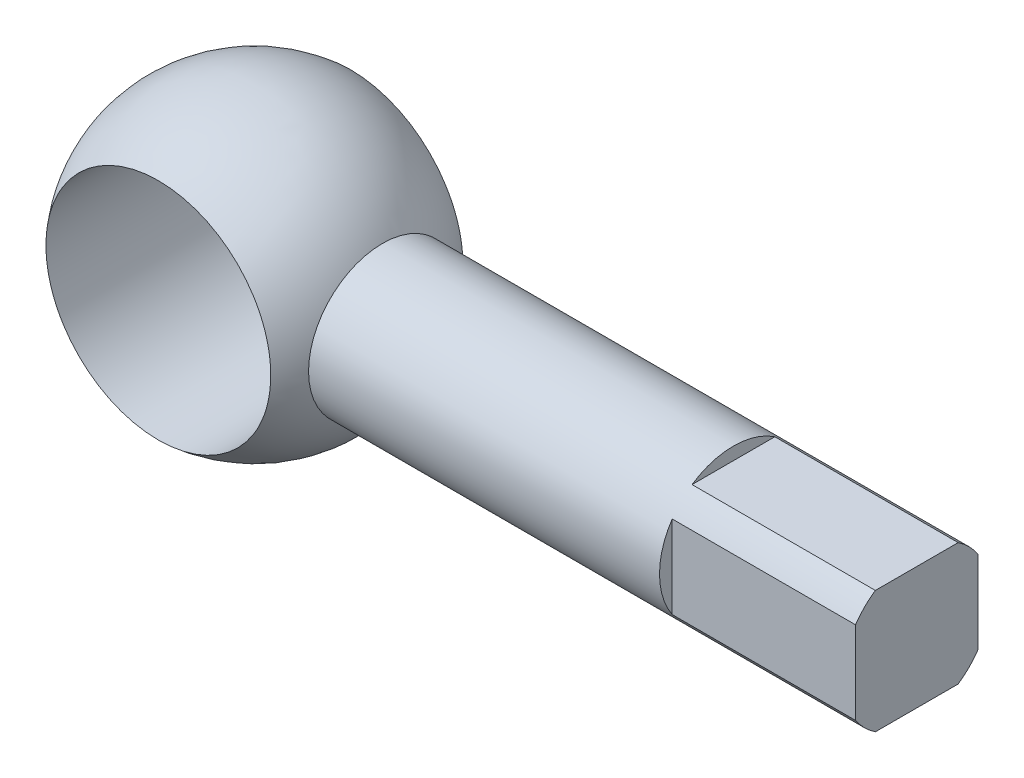
ISO-10303-21;
HEADER;
FILE_DESCRIPTION(('STEP AP214'),'2;1');
FILE_NAME('part.step','',(''),(''),'','','');
FILE_SCHEMA(('AUTOMOTIVE_DESIGN { 1 0 10303 214 1 1 1 1 }'));
ENDSEC;
DATA;
#1=APPLICATION_CONTEXT('core data for automotive mechanical design processes');
#2=APPLICATION_PROTOCOL_DEFINITION('international standard','automotive_design',2000,#1);
#3=PRODUCT_CONTEXT('',#1,'mechanical');
#4=PRODUCT('Part','Part','',(#3));
#5=PRODUCT_RELATED_PRODUCT_CATEGORY('part','',(#4));
#6=PRODUCT_DEFINITION_FORMATION('','',#4);
#7=PRODUCT_DEFINITION_CONTEXT('part definition',#1,'design');
#8=PRODUCT_DEFINITION('design','',#6,#7);
#9=PRODUCT_DEFINITION_SHAPE('','',#8);
#10=(LENGTH_UNIT() NAMED_UNIT(*) SI_UNIT(.MILLI.,.METRE.));
#11=(NAMED_UNIT(*) PLANE_ANGLE_UNIT() SI_UNIT($,.RADIAN.));
#12=(NAMED_UNIT(*) SI_UNIT($,.STERADIAN.) SOLID_ANGLE_UNIT());
#13=UNCERTAINTY_MEASURE_WITH_UNIT(LENGTH_MEASURE(1.E-05),#10,'distance_accuracy_value','');
#14=(GEOMETRIC_REPRESENTATION_CONTEXT(3) GLOBAL_UNCERTAINTY_ASSIGNED_CONTEXT((#13)) GLOBAL_UNIT_ASSIGNED_CONTEXT((#10,
#11,#12)) REPRESENTATION_CONTEXT('',''));
#15=CARTESIAN_POINT('',(0.,0.,0.));
#16=DIRECTION('',(0.,0.,1.));
#17=DIRECTION('',(1.,0.,0.));
#18=AXIS2_PLACEMENT_3D('',#15,#16,#17);
#19=CARTESIAN_POINT('',(0.,0.,0.));
#20=DIRECTION('',(-1.,0.,0.));
#21=DIRECTION('',(0.,1.,0.));
#22=AXIS2_PLACEMENT_3D('',#19,#20,#21);
#23=SPHERICAL_SURFACE('',#22,25.);
#24=CARTESIAN_POINT('',(0.,0.,16.2480768092719));
#25=DIRECTION('',(0.,0.,-1.));
#26=DIRECTION('',(-1.,0.,0.));
#27=AXIS2_PLACEMENT_3D('',#24,#25,#26);
#28=CIRCLE('',#27,19.);
#29=CARTESIAN_POINT('',(-19.,0.,16.2480768092719));
#30=VERTEX_POINT('',#29);
#31=EDGE_CURVE('E139',#30,#30,#28,.T.);
#32=ORIENTED_EDGE('',*,*,#31,.T.);
#33=EDGE_LOOP('',(#32));
#34=FACE_BOUND('',#33,.T.);
#35=CARTESIAN_POINT('',(0.,0.,-16.2480768092719));
#36=DIRECTION('',(0.,0.,1.));
#37=DIRECTION('',(1.,0.,0.));
#38=AXIS2_PLACEMENT_3D('',#35,#36,#37);
#39=CIRCLE('',#38,19.);
#40=CARTESIAN_POINT('',(19.,0.,-16.2480768092719));
#41=VERTEX_POINT('',#40);
#42=EDGE_CURVE('E144',#41,#41,#39,.T.);
#43=ORIENTED_EDGE('',*,*,#42,.T.);
#44=EDGE_LOOP('',(#43));
#45=FACE_BOUND('',#44,.T.);
#46=CARTESIAN_POINT('',(21.650635094611,0.,0.));
#47=DIRECTION('',(-1.,0.,0.));
#48=DIRECTION('',(0.,0.,1.));
#49=AXIS2_PLACEMENT_3D('',#46,#47,#48);
#50=CIRCLE('',#49,12.5);
#51=CARTESIAN_POINT('',(21.650635094611,0.,12.5));
#52=VERTEX_POINT('',#51);
#53=EDGE_CURVE('E129',#52,#52,#50,.T.);
#54=ORIENTED_EDGE('',*,*,#53,.T.);
#55=EDGE_LOOP('',(#54));
#56=FACE_BOUND('',#55,.T.);
#57=ADVANCED_FACE('F45',(#34,#45,#56),#23,.T.);
#58=CARTESIAN_POINT('',(-25.,0.,0.));
#59=DIRECTION('',(-1.,0.,0.));
#60=DIRECTION('',(0.,0.,1.));
#61=AXIS2_PLACEMENT_3D('',#58,#59,#60);
#62=CYLINDRICAL_SURFACE('',#61,12.5);
#63=CARTESIAN_POINT('',(112.,0.,0.));
#64=DIRECTION('',(-1.,0.,0.));
#65=DIRECTION('',(0.,0.,1.));
#66=AXIS2_PLACEMENT_3D('',#63,#64,#65);
#67=CIRCLE('',#66,12.5);
#68=CARTESIAN_POINT('',(112.,10.356157588604,-7.));
#69=VERTEX_POINT('',#68);
#70=CARTESIAN_POINT('',(112.,7.,-10.356157588604));
#71=VERTEX_POINT('',#70);
#72=EDGE_CURVE('E120',#69,#71,#67,.T.);
#73=ORIENTED_EDGE('',*,*,#72,.T.);
#74=DIRECTION('',(1.,0.,0.));
#75=VECTOR('',#74,1.);
#76=CARTESIAN_POINT('',(81.,6.99999999999996,-10.356157588604));
#77=LINE('',#76,#75);
#78=CARTESIAN_POINT('',(81.,6.99999999999996,-10.356157588604));
#79=VERTEX_POINT('',#78);
#80=EDGE_CURVE('E105',#79,#71,#77,.T.);
#81=ORIENTED_EDGE('',*,*,#80,.F.);
#82=CARTESIAN_POINT('',(81.,0.,0.));
#83=DIRECTION('',(1.,0.,0.));
#84=DIRECTION('',(0.,-1.,0.));
#85=AXIS2_PLACEMENT_3D('',#82,#83,#84);
#86=CIRCLE('',#85,12.5);
#87=CARTESIAN_POINT('',(81.,-7.00000000000004,-10.356157588604));
#88=VERTEX_POINT('',#87);
#89=EDGE_CURVE('E167',#88,#79,#86,.T.);
#90=ORIENTED_EDGE('',*,*,#89,.F.);
#91=DIRECTION('',(1.,0.,0.));
#92=VECTOR('',#91,1.);
#93=CARTESIAN_POINT('',(81.,-7.00000000000004,-10.356157588604));
#94=LINE('',#93,#92);
#95=CARTESIAN_POINT('',(112.,-7.00000000000004,-10.356157588604));
#96=VERTEX_POINT('',#95);
#97=EDGE_CURVE('E113',#88,#96,#94,.T.);
#98=ORIENTED_EDGE('',*,*,#97,.T.);
#99=CARTESIAN_POINT('',(112.,-10.356157588604,-7.));
#100=VERTEX_POINT('',#99);
#101=EDGE_CURVE('E123',#96,#100,#67,.T.);
#102=ORIENTED_EDGE('',*,*,#101,.T.);
#103=DIRECTION('',(1.,0.,0.));
#104=VECTOR('',#103,1.);
#105=CARTESIAN_POINT('',(81.,-10.356157588604,-7.));
#106=LINE('',#105,#104);
#107=CARTESIAN_POINT('',(81.,-10.356157588604,-7.));
#108=VERTEX_POINT('',#107);
#109=EDGE_CURVE('E164',#108,#100,#106,.T.);
#110=ORIENTED_EDGE('',*,*,#109,.F.);
#111=CARTESIAN_POINT('',(81.,0.,0.));
#112=DIRECTION('',(1.,0.,0.));
#113=DIRECTION('',(0.,0.,1.));
#114=AXIS2_PLACEMENT_3D('',#111,#112,#113);
#115=CIRCLE('',#114,12.5);
#116=CARTESIAN_POINT('',(81.,-10.356157588604,7.));
#117=VERTEX_POINT('',#116);
#118=EDGE_CURVE('E175',#117,#108,#115,.T.);
#119=ORIENTED_EDGE('',*,*,#118,.F.);
#120=DIRECTION('',(1.,0.,0.));
#121=VECTOR('',#120,1.);
#122=CARTESIAN_POINT('',(81.,-10.356157588604,7.));
#123=LINE('',#122,#121);
#124=CARTESIAN_POINT('',(112.,-10.356157588604,7.));
#125=VERTEX_POINT('',#124);
#126=EDGE_CURVE('E186',#117,#125,#123,.T.);
#127=ORIENTED_EDGE('',*,*,#126,.T.);
#128=CARTESIAN_POINT('',(112.,-7.,10.356157588604));
#129=VERTEX_POINT('',#128);
#130=EDGE_CURVE('E136',#125,#129,#67,.T.);
#131=ORIENTED_EDGE('',*,*,#130,.T.);
#132=DIRECTION('',(1.,0.,0.));
#133=VECTOR('',#132,1.);
#134=CARTESIAN_POINT('',(81.,-6.99999999999989,10.3561575886041));
#135=LINE('',#134,#133);
#136=CARTESIAN_POINT('',(81.,-6.99999999999989,10.3561575886041));
#137=VERTEX_POINT('',#136);
#138=EDGE_CURVE('E62',#137,#129,#135,.T.);
#139=ORIENTED_EDGE('',*,*,#138,.F.);
#140=CARTESIAN_POINT('',(81.,0.,0.));
#141=DIRECTION('',(1.,0.,0.));
#142=DIRECTION('',(0.,1.,0.));
#143=AXIS2_PLACEMENT_3D('',#140,#141,#142);
#144=CIRCLE('',#143,12.5);
#145=CARTESIAN_POINT('',(81.,7.00000000000011,10.3561575886039));
#146=VERTEX_POINT('',#145);
#147=EDGE_CURVE('E189',#146,#137,#144,.T.);
#148=ORIENTED_EDGE('',*,*,#147,.F.);
#149=DIRECTION('',(1.,0.,0.));
#150=VECTOR('',#149,1.);
#151=CARTESIAN_POINT('',(81.,7.00000000000011,10.3561575886039));
#152=LINE('',#151,#150);
#153=CARTESIAN_POINT('',(112.,7.00000000000011,10.3561575886039));
#154=VERTEX_POINT('',#153);
#155=EDGE_CURVE('E180',#146,#154,#152,.T.);
#156=ORIENTED_EDGE('',*,*,#155,.T.);
#157=CARTESIAN_POINT('',(112.,10.356157588604,7.));
#158=VERTEX_POINT('',#157);
#159=EDGE_CURVE('E101',#154,#158,#67,.T.);
#160=ORIENTED_EDGE('',*,*,#159,.T.);
#161=DIRECTION('',(1.,0.,0.));
#162=VECTOR('',#161,1.);
#163=CARTESIAN_POINT('',(81.,10.356157588604,7.));
#164=LINE('',#163,#162);
#165=CARTESIAN_POINT('',(81.,10.356157588604,7.));
#166=VERTEX_POINT('',#165);
#167=EDGE_CURVE('E203',#166,#158,#164,.T.);
#168=ORIENTED_EDGE('',*,*,#167,.F.);
#169=CARTESIAN_POINT('',(81.,0.,0.));
#170=DIRECTION('',(1.,0.,0.));
#171=DIRECTION('',(0.,0.,-1.));
#172=AXIS2_PLACEMENT_3D('',#169,#170,#171);
#173=CIRCLE('',#172,12.5);
#174=CARTESIAN_POINT('',(81.,10.356157588604,-7.));
#175=VERTEX_POINT('',#174);
#176=EDGE_CURVE('E85',#175,#166,#173,.T.);
#177=ORIENTED_EDGE('',*,*,#176,.F.);
#178=DIRECTION('',(1.,0.,0.));
#179=VECTOR('',#178,1.);
#180=CARTESIAN_POINT('',(81.,10.356157588604,-7.));
#181=LINE('',#180,#179);
#182=EDGE_CURVE('E127',#175,#69,#181,.T.);
#183=ORIENTED_EDGE('',*,*,#182,.T.);
#184=EDGE_LOOP('',(#73,#81,#90,#98,#102,#110,#119,#127,#131,#139,#148,#156,#160,#168,#177,#183));
#185=FACE_BOUND('',#184,.T.);
#186=ORIENTED_EDGE('',*,*,#53,.F.);
#187=EDGE_LOOP('',(#186));
#188=FACE_BOUND('',#187,.T.);
#189=ADVANCED_FACE('F125',(#185,#188),#62,.T.);
#190=CARTESIAN_POINT('',(112.,12.5,0.));
#191=DIRECTION('',(-1.,0.,0.));
#192=DIRECTION('',(0.,0.,1.));
#193=AXIS2_PLACEMENT_3D('',#190,#191,#192);
#194=PLANE('',#193);
#195=ORIENTED_EDGE('',*,*,#101,.F.);
#196=DIRECTION('',(0.,1.,0.));
#197=VECTOR('',#196,1.);
#198=CARTESIAN_POINT('',(112.,12.5,-10.356157588604));
#199=LINE('',#198,#197);
#200=EDGE_CURVE('E11',#96,#71,#199,.T.);
#201=ORIENTED_EDGE('',*,*,#200,.T.);
#202=ORIENTED_EDGE('',*,*,#72,.F.);
#203=DIRECTION('',(0.,0.,1.));
#204=VECTOR('',#203,1.);
#205=CARTESIAN_POINT('',(112.,10.356157588604,0.));
#206=LINE('',#205,#204);
#207=EDGE_CURVE('E134',#69,#158,#206,.T.);
#208=ORIENTED_EDGE('',*,*,#207,.T.);
#209=ORIENTED_EDGE('',*,*,#159,.F.);
#210=DIRECTION('',(0.,1.,0.));
#211=VECTOR('',#210,1.);
#212=CARTESIAN_POINT('',(112.,12.5,10.3561575886039));
#213=LINE('',#212,#211);
#214=EDGE_CURVE('E154',#154,#129,#213,.F.);
#215=ORIENTED_EDGE('',*,*,#214,.T.);
#216=ORIENTED_EDGE('',*,*,#130,.F.);
#217=DIRECTION('',(0.,0.,1.));
#218=VECTOR('',#217,1.);
#219=CARTESIAN_POINT('',(112.,-10.356157588604,0.));
#220=LINE('',#219,#218);
#221=EDGE_CURVE('E54',#125,#100,#220,.F.);
#222=ORIENTED_EDGE('',*,*,#221,.T.);
#223=EDGE_LOOP('',(#195,#201,#202,#208,#209,#215,#216,#222));
#224=FACE_BOUND('',#223,.T.);
#225=ADVANCED_FACE('F118',(#224),#194,.F.);
#226=CARTESIAN_POINT('',(0.,0.,-25.));
#227=DIRECTION('',(0.,0.,1.));
#228=DIRECTION('',(1.,0.,0.));
#229=AXIS2_PLACEMENT_3D('',#226,#227,#228);
#230=CYLINDRICAL_SURFACE('',#229,19.);
#231=ORIENTED_EDGE('',*,*,#42,.F.);
#232=EDGE_LOOP('',(#231));
#233=FACE_BOUND('',#232,.T.);
#234=ORIENTED_EDGE('',*,*,#31,.F.);
#235=EDGE_LOOP('',(#234));
#236=FACE_BOUND('',#235,.T.);
#237=ADVANCED_FACE('F242',(#233,#236),#230,.F.);
#238=CARTESIAN_POINT('',(81.,10.356157588604,7.));
#239=DIRECTION('',(0.,-1.,0.));
#240=DIRECTION('',(0.,0.,-1.));
#241=AXIS2_PLACEMENT_3D('',#238,#239,#240);
#242=PLANE('',#241);
#243=ORIENTED_EDGE('',*,*,#182,.F.);
#244=DIRECTION('',(0.,0.,-1.));
#245=VECTOR('',#244,1.);
#246=CARTESIAN_POINT('',(81.,10.356157588604,7.));
#247=LINE('',#246,#245);
#248=EDGE_CURVE('E171',#166,#175,#247,.T.);
#249=ORIENTED_EDGE('',*,*,#248,.F.);
#250=ORIENTED_EDGE('',*,*,#167,.T.);
#251=ORIENTED_EDGE('',*,*,#207,.F.);
#252=EDGE_LOOP('',(#243,#249,#250,#251));
#253=FACE_BOUND('',#252,.T.);
#254=ADVANCED_FACE('F207',(#253),#242,.F.);
#255=CARTESIAN_POINT('',(81.,0.,0.));
#256=DIRECTION('',(1.,0.,0.));
#257=DIRECTION('',(0.,0.,-1.));
#258=AXIS2_PLACEMENT_3D('',#255,#256,#257);
#259=PLANE('',#258);
#260=ORIENTED_EDGE('',*,*,#176,.T.);
#261=ORIENTED_EDGE('',*,*,#248,.T.);
#262=EDGE_LOOP('',(#260,#261));
#263=FACE_BOUND('',#262,.T.);
#264=ADVANCED_FACE('F248',(#263),#259,.T.);
#265=CARTESIAN_POINT('',(81.,-6.99999999999989,10.3561575886041));
#266=DIRECTION('',(0.,0.,-1.));
#267=DIRECTION('',(0.,1.,0.));
#268=AXIS2_PLACEMENT_3D('',#265,#266,#267);
#269=PLANE('',#268);
#270=ORIENTED_EDGE('',*,*,#155,.F.);
#271=DIRECTION('',(0.,1.,0.));
#272=VECTOR('',#271,1.);
#273=CARTESIAN_POINT('',(81.,-6.99999999999989,10.3561575886041));
#274=LINE('',#273,#272);
#275=EDGE_CURVE('E193',#137,#146,#274,.T.);
#276=ORIENTED_EDGE('',*,*,#275,.F.);
#277=ORIENTED_EDGE('',*,*,#138,.T.);
#278=ORIENTED_EDGE('',*,*,#214,.F.);
#279=EDGE_LOOP('',(#270,#276,#277,#278));
#280=FACE_BOUND('',#279,.T.);
#281=ADVANCED_FACE('F217',(#280),#269,.F.);
#282=CARTESIAN_POINT('',(81.,0.,0.));
#283=DIRECTION('',(1.,0.,0.));
#284=DIRECTION('',(0.,1.,0.));
#285=AXIS2_PLACEMENT_3D('',#282,#283,#284);
#286=PLANE('',#285);
#287=ORIENTED_EDGE('',*,*,#147,.T.);
#288=ORIENTED_EDGE('',*,*,#275,.T.);
#289=EDGE_LOOP('',(#287,#288));
#290=FACE_BOUND('',#289,.T.);
#291=ADVANCED_FACE('F218',(#290),#286,.T.);
#292=CARTESIAN_POINT('',(81.,-10.356157588604,-7.));
#293=DIRECTION('',(0.,1.,0.));
#294=DIRECTION('',(0.,0.,1.));
#295=AXIS2_PLACEMENT_3D('',#292,#293,#294);
#296=PLANE('',#295);
#297=ORIENTED_EDGE('',*,*,#126,.F.);
#298=DIRECTION('',(0.,0.,1.));
#299=VECTOR('',#298,1.);
#300=CARTESIAN_POINT('',(81.,-10.356157588604,-7.));
#301=LINE('',#300,#299);
#302=EDGE_CURVE('E179',#108,#117,#301,.T.);
#303=ORIENTED_EDGE('',*,*,#302,.F.);
#304=ORIENTED_EDGE('',*,*,#109,.T.);
#305=ORIENTED_EDGE('',*,*,#221,.F.);
#306=EDGE_LOOP('',(#297,#303,#304,#305));
#307=FACE_BOUND('',#306,.T.);
#308=ADVANCED_FACE('F220',(#307),#296,.F.);
#309=CARTESIAN_POINT('',(81.,0.,0.));
#310=DIRECTION('',(1.,0.,0.));
#311=DIRECTION('',(0.,0.,1.));
#312=AXIS2_PLACEMENT_3D('',#309,#310,#311);
#313=PLANE('',#312);
#314=ORIENTED_EDGE('',*,*,#118,.T.);
#315=ORIENTED_EDGE('',*,*,#302,.T.);
#316=EDGE_LOOP('',(#314,#315));
#317=FACE_BOUND('',#316,.T.);
#318=ADVANCED_FACE('F222',(#317),#313,.T.);
#319=CARTESIAN_POINT('',(81.,6.99999999999996,-10.356157588604));
#320=DIRECTION('',(0.,0.,1.));
#321=DIRECTION('',(0.,-1.,0.));
#322=AXIS2_PLACEMENT_3D('',#319,#320,#321);
#323=PLANE('',#322);
#324=ORIENTED_EDGE('',*,*,#97,.F.);
#325=DIRECTION('',(0.,-1.,0.));
#326=VECTOR('',#325,1.);
#327=CARTESIAN_POINT('',(81.,6.99999999999996,-10.356157588604));
#328=LINE('',#327,#326);
#329=EDGE_CURVE('E109',#79,#88,#328,.T.);
#330=ORIENTED_EDGE('',*,*,#329,.F.);
#331=ORIENTED_EDGE('',*,*,#80,.T.);
#332=ORIENTED_EDGE('',*,*,#200,.F.);
#333=EDGE_LOOP('',(#324,#330,#331,#332));
#334=FACE_BOUND('',#333,.T.);
#335=ADVANCED_FACE('F106',(#334),#323,.F.);
#336=CARTESIAN_POINT('',(81.,0.,0.));
#337=DIRECTION('',(1.,0.,0.));
#338=DIRECTION('',(0.,-1.,0.));
#339=AXIS2_PLACEMENT_3D('',#336,#337,#338);
#340=PLANE('',#339);
#341=ORIENTED_EDGE('',*,*,#89,.T.);
#342=ORIENTED_EDGE('',*,*,#329,.T.);
#343=EDGE_LOOP('',(#341,#342));
#344=FACE_BOUND('',#343,.T.);
#345=ADVANCED_FACE('F229',(#344),#340,.T.);
#346=CLOSED_SHELL('',(#57,#189,#225,#237,#254,#264,#281,#291,#308,#318,#335,#345));
#347=MANIFOLD_SOLID_BREP('B2',#346);
#348=ADVANCED_BREP_SHAPE_REPRESENTATION('',(#18,#347),#14);
#349=SHAPE_DEFINITION_REPRESENTATION(#9,#348);
ENDSEC;
END-ISO-10303-21;
